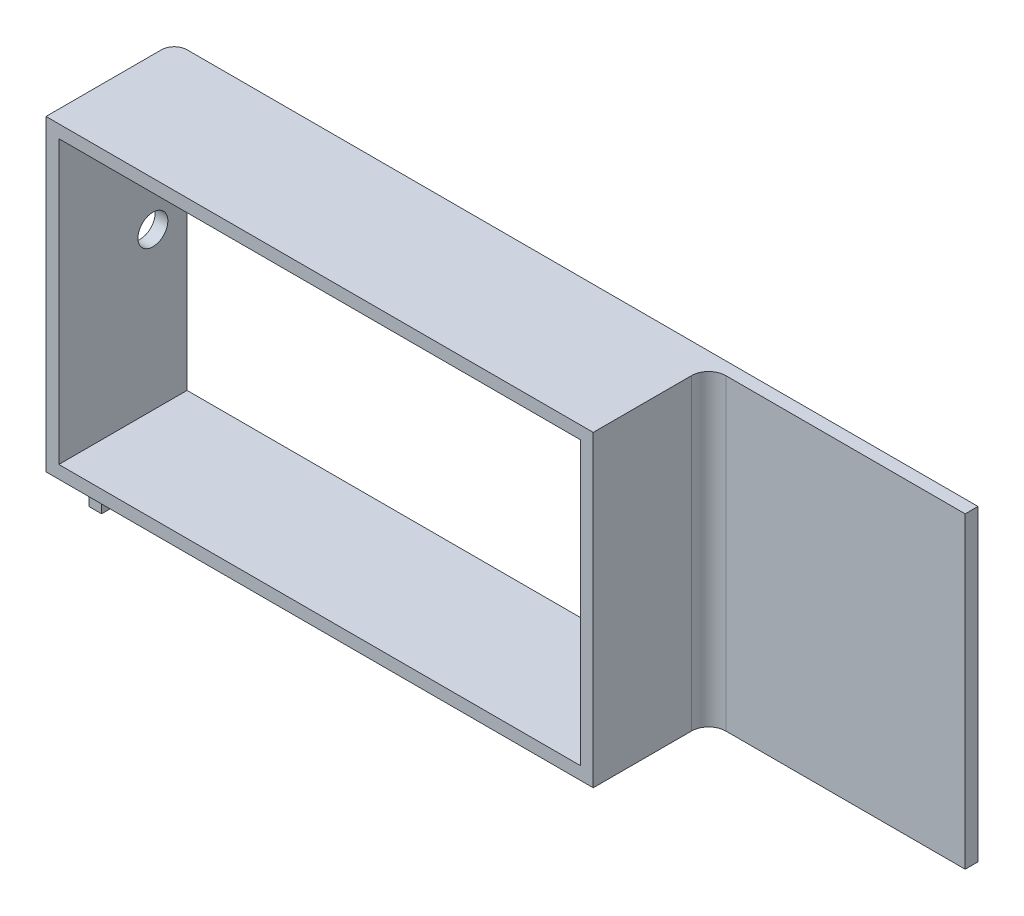
ISO-10303-21;
HEADER;
FILE_DESCRIPTION(('STEP AP214'),'2;1');
FILE_NAME('part.step','',(''),(''),'','','');
FILE_SCHEMA(('AUTOMOTIVE_DESIGN { 1 0 10303 214 1 1 1 1 }'));
ENDSEC;
DATA;
#1=APPLICATION_CONTEXT('core data for automotive mechanical design processes');
#2=APPLICATION_PROTOCOL_DEFINITION('international standard','automotive_design',2000,#1);
#3=PRODUCT_CONTEXT('',#1,'mechanical');
#4=PRODUCT('Part','Part','',(#3));
#5=PRODUCT_RELATED_PRODUCT_CATEGORY('part','',(#4));
#6=PRODUCT_DEFINITION_FORMATION('','',#4);
#7=PRODUCT_DEFINITION_CONTEXT('part definition',#1,'design');
#8=PRODUCT_DEFINITION('design','',#6,#7);
#9=PRODUCT_DEFINITION_SHAPE('','',#8);
#10=(LENGTH_UNIT() NAMED_UNIT(*) SI_UNIT(.MILLI.,.METRE.));
#11=(NAMED_UNIT(*) PLANE_ANGLE_UNIT() SI_UNIT($,.RADIAN.));
#12=(NAMED_UNIT(*) SI_UNIT($,.STERADIAN.) SOLID_ANGLE_UNIT());
#13=UNCERTAINTY_MEASURE_WITH_UNIT(LENGTH_MEASURE(1.E-05),#10,'distance_accuracy_value','');
#14=(GEOMETRIC_REPRESENTATION_CONTEXT(3) GLOBAL_UNCERTAINTY_ASSIGNED_CONTEXT((#13)) GLOBAL_UNIT_ASSIGNED_CONTEXT((#10,
#11,#12)) REPRESENTATION_CONTEXT('',''));
#15=CARTESIAN_POINT('',(0.,0.,0.));
#16=DIRECTION('',(0.,0.,1.));
#17=DIRECTION('',(1.,0.,0.));
#18=AXIS2_PLACEMENT_3D('',#15,#16,#17);
#19=CARTESIAN_POINT('',(0.,0.,0.));
#20=DIRECTION('',(0.,0.,-1.));
#21=DIRECTION('',(-1.,0.,0.));
#22=AXIS2_PLACEMENT_3D('',#19,#20,#21);
#23=PLANE('',#22);
#24=DIRECTION('',(1.,0.,0.));
#25=VECTOR('',#24,1.);
#26=CARTESIAN_POINT('',(30.5,-18.,0.));
#27=LINE('',#26,#25);
#28=CARTESIAN_POINT('',(-30.5,-18.,0.));
#29=VERTEX_POINT('',#28);
#30=CARTESIAN_POINT('',(62.,-18.,0.));
#31=VERTEX_POINT('',#30);
#32=EDGE_CURVE('E216',#29,#31,#27,.T.);
#33=ORIENTED_EDGE('',*,*,#32,.F.);
#34=DIRECTION('',(0.,-1.,0.));
#35=VECTOR('',#34,1.);
#36=CARTESIAN_POINT('',(-30.5,0.,0.));
#37=LINE('',#36,#35);
#38=CARTESIAN_POINT('',(-30.5,-16.5,0.));
#39=VERTEX_POINT('',#38);
#40=EDGE_CURVE('E98',#29,#39,#37,.F.);
#41=ORIENTED_EDGE('',*,*,#40,.T.);
#42=DIRECTION('',(1.,0.,0.));
#43=VECTOR('',#42,1.);
#44=CARTESIAN_POINT('',(-30.5,-16.5,0.));
#45=LINE('',#44,#43);
#46=CARTESIAN_POINT('',(30.5,-16.5,0.));
#47=VERTEX_POINT('',#46);
#48=EDGE_CURVE('E268',#39,#47,#45,.T.);
#49=ORIENTED_EDGE('',*,*,#48,.T.);
#50=DIRECTION('',(0.,1.,0.));
#51=VECTOR('',#50,1.);
#52=CARTESIAN_POINT('',(30.5,-16.5,0.));
#53=LINE('',#52,#51);
#54=CARTESIAN_POINT('',(30.5,16.5,0.));
#55=VERTEX_POINT('',#54);
#56=EDGE_CURVE('E291',#47,#55,#53,.T.);
#57=ORIENTED_EDGE('',*,*,#56,.T.);
#58=DIRECTION('',(-1.,0.,0.));
#59=VECTOR('',#58,1.);
#60=CARTESIAN_POINT('',(-30.5,16.5,0.));
#61=LINE('',#60,#59);
#62=CARTESIAN_POINT('',(-30.5,16.5,0.));
#63=VERTEX_POINT('',#62);
#64=EDGE_CURVE('E295',#55,#63,#61,.T.);
#65=ORIENTED_EDGE('',*,*,#64,.T.);
#66=DIRECTION('',(0.,-1.,0.));
#67=VECTOR('',#66,1.);
#68=CARTESIAN_POINT('',(-30.5,0.,0.));
#69=LINE('',#68,#67);
#70=CARTESIAN_POINT('',(-30.5,18.,0.));
#71=VERTEX_POINT('',#70);
#72=EDGE_CURVE('E105',#63,#71,#69,.F.);
#73=ORIENTED_EDGE('',*,*,#72,.T.);
#74=DIRECTION('',(-1.,0.,0.));
#75=VECTOR('',#74,1.);
#76=CARTESIAN_POINT('',(-30.5,18.,0.));
#77=LINE('',#76,#75);
#78=CARTESIAN_POINT('',(62.,18.,0.));
#79=VERTEX_POINT('',#78);
#80=EDGE_CURVE('E393',#79,#71,#77,.T.);
#81=ORIENTED_EDGE('',*,*,#80,.F.);
#82=DIRECTION('',(0.,1.,0.));
#83=VECTOR('',#82,1.);
#84=CARTESIAN_POINT('',(62.,18.,0.));
#85=LINE('',#84,#83);
#86=EDGE_CURVE('E224',#31,#79,#85,.T.);
#87=ORIENTED_EDGE('',*,*,#86,.F.);
#88=EDGE_LOOP('',(#33,#41,#49,#57,#65,#73,#81,#87));
#89=FACE_BOUND('',#88,.T.);
#90=ADVANCED_FACE('F89',(#89),#23,.T.);
#91=CARTESIAN_POINT('',(-30.5,18.,5.));
#92=DIRECTION('',(0.,1.,0.));
#93=DIRECTION('',(1.,0.,0.));
#94=AXIS2_PLACEMENT_3D('',#91,#92,#93);
#95=PLANE('',#94);
#96=ORIENTED_EDGE('',*,*,#80,.T.);
#97=CARTESIAN_POINT('',(-30.5,18.,1.5));
#98=DIRECTION('',(0.,1.,0.));
#99=DIRECTION('',(0.,0.,1.));
#100=AXIS2_PLACEMENT_3D('',#97,#98,#99);
#101=CIRCLE('',#100,1.5);
#102=CARTESIAN_POINT('',(-32.,18.,1.5));
#103=VERTEX_POINT('',#102);
#104=EDGE_CURVE('E12',#71,#103,#101,.T.);
#105=ORIENTED_EDGE('',*,*,#104,.T.);
#106=DIRECTION('',(0.,0.,1.));
#107=VECTOR('',#106,1.);
#108=CARTESIAN_POINT('',(-32.,18.,5.));
#109=LINE('',#108,#107);
#110=CARTESIAN_POINT('',(-32.,18.,15.));
#111=VERTEX_POINT('',#110);
#112=EDGE_CURVE('E281',#103,#111,#109,.T.);
#113=ORIENTED_EDGE('',*,*,#112,.T.);
#114=DIRECTION('',(-1.,0.,0.));
#115=VECTOR('',#114,1.);
#116=CARTESIAN_POINT('',(0.,18.,15.));
#117=LINE('',#116,#115);
#118=CARTESIAN_POINT('',(32.,18.,15.));
#119=VERTEX_POINT('',#118);
#120=EDGE_CURVE('E435',#119,#111,#117,.T.);
#121=ORIENTED_EDGE('',*,*,#120,.F.);
#122=DIRECTION('',(0.,0.,-1.));
#123=VECTOR('',#122,1.);
#124=CARTESIAN_POINT('',(32.,18.,5.));
#125=LINE('',#124,#123);
#126=CARTESIAN_POINT('',(32.,18.,3.5));
#127=VERTEX_POINT('',#126);
#128=EDGE_CURVE('E390',#119,#127,#125,.T.);
#129=ORIENTED_EDGE('',*,*,#128,.T.);
#130=CARTESIAN_POINT('',(34.,18.,3.5));
#131=DIRECTION('',(0.,1.,0.));
#132=DIRECTION('',(0.,0.,1.));
#133=AXIS2_PLACEMENT_3D('',#130,#131,#132);
#134=CIRCLE('',#133,2.);
#135=CARTESIAN_POINT('',(34.,18.,1.5));
#136=VERTEX_POINT('',#135);
#137=EDGE_CURVE('E249',#127,#136,#134,.F.);
#138=ORIENTED_EDGE('',*,*,#137,.T.);
#139=DIRECTION('',(-1.,0.,0.));
#140=VECTOR('',#139,1.);
#141=CARTESIAN_POINT('',(62.,18.,1.5));
#142=LINE('',#141,#140);
#143=CARTESIAN_POINT('',(62.,18.,1.5));
#144=VERTEX_POINT('',#143);
#145=EDGE_CURVE('E483',#144,#136,#142,.T.);
#146=ORIENTED_EDGE('',*,*,#145,.F.);
#147=DIRECTION('',(0.,0.,1.));
#148=VECTOR('',#147,1.);
#149=CARTESIAN_POINT('',(62.,18.,0.));
#150=LINE('',#149,#148);
#151=EDGE_CURVE('E395',#79,#144,#150,.T.);
#152=ORIENTED_EDGE('',*,*,#151,.F.);
#153=EDGE_LOOP('',(#96,#105,#113,#121,#129,#138,#146,#152));
#154=FACE_BOUND('',#153,.T.);
#155=ADVANCED_FACE('F361',(#154),#95,.T.);
#156=CARTESIAN_POINT('',(32.,16.5,5.));
#157=DIRECTION('',(1.,0.,0.));
#158=DIRECTION('',(0.,-1.,0.));
#159=AXIS2_PLACEMENT_3D('',#156,#157,#158);
#160=PLANE('',#159);
#161=DIRECTION('',(0.,0.,-1.));
#162=VECTOR('',#161,1.);
#163=CARTESIAN_POINT('',(32.,-18.,5.00000000000007));
#164=LINE('',#163,#162);
#165=CARTESIAN_POINT('',(32.,-18.,15.));
#166=VERTEX_POINT('',#165);
#167=CARTESIAN_POINT('',(32.,-18.,3.49999999999999));
#168=VERTEX_POINT('',#167);
#169=EDGE_CURVE('E403',#166,#168,#164,.T.);
#170=ORIENTED_EDGE('',*,*,#169,.T.);
#171=DIRECTION('',(0.,-1.,0.));
#172=VECTOR('',#171,1.);
#173=CARTESIAN_POINT('',(32.,16.5,3.5));
#174=LINE('',#173,#172);
#175=EDGE_CURVE('E243',#168,#127,#174,.F.);
#176=ORIENTED_EDGE('',*,*,#175,.T.);
#177=ORIENTED_EDGE('',*,*,#128,.F.);
#178=DIRECTION('',(0.,1.,0.));
#179=VECTOR('',#178,1.);
#180=CARTESIAN_POINT('',(32.,0.,15.));
#181=LINE('',#180,#179);
#182=EDGE_CURVE('E438',#166,#119,#181,.T.);
#183=ORIENTED_EDGE('',*,*,#182,.F.);
#184=EDGE_LOOP('',(#170,#176,#177,#183));
#185=FACE_BOUND('',#184,.T.);
#186=ADVANCED_FACE('F364',(#185),#160,.T.);
#187=CARTESIAN_POINT('',(-32.,-16.5,5.));
#188=DIRECTION('',(-1.,0.,0.));
#189=DIRECTION('',(0.,1.,0.));
#190=AXIS2_PLACEMENT_3D('',#187,#188,#189);
#191=PLANE('',#190);
#192=CARTESIAN_POINT('',(-32.,1.8,4.));
#193=DIRECTION('',(-1.,0.,0.));
#194=DIRECTION('',(0.,0.,1.));
#195=AXIS2_PLACEMENT_3D('',#192,#193,#194);
#196=CIRCLE('',#195,1.75);
#197=CARTESIAN_POINT('',(-32.,1.8,5.75));
#198=VERTEX_POINT('',#197);
#199=EDGE_CURVE('E377',#198,#198,#196,.T.);
#200=ORIENTED_EDGE('',*,*,#199,.F.);
#201=EDGE_LOOP('',(#200));
#202=FACE_BOUND('',#201,.T.);
#203=CARTESIAN_POINT('',(-32.,-18.5,4.));
#204=DIRECTION('',(-1.,0.,0.));
#205=DIRECTION('',(0.,0.,1.));
#206=AXIS2_PLACEMENT_3D('',#203,#204,#205);
#207=CIRCLE('',#206,1.75);
#208=CARTESIAN_POINT('',(-32.,-18.5,5.74999999999999));
#209=VERTEX_POINT('',#208);
#210=EDGE_CURVE('E225',#209,#209,#207,.T.);
#211=ORIENTED_EDGE('',*,*,#210,.F.);
#212=EDGE_LOOP('',(#211));
#213=FACE_BOUND('',#212,.T.);
#214=ORIENTED_EDGE('',*,*,#112,.F.);
#215=DIRECTION('',(0.,-1.,0.));
#216=VECTOR('',#215,1.);
#217=CARTESIAN_POINT('',(-32.,-16.5,1.5));
#218=LINE('',#217,#216);
#219=CARTESIAN_POINT('',(-32.,-24.,1.5));
#220=VERTEX_POINT('',#219);
#221=EDGE_CURVE('E252',#103,#220,#218,.T.);
#222=ORIENTED_EDGE('',*,*,#221,.T.);
#223=DIRECTION('',(0.,0.,-1.));
#224=VECTOR('',#223,1.);
#225=CARTESIAN_POINT('',(-32.,-24.,10.));
#226=LINE('',#225,#224);
#227=CARTESIAN_POINT('',(-32.,-24.,10.));
#228=VERTEX_POINT('',#227);
#229=EDGE_CURVE('E471',#228,#220,#226,.T.);
#230=ORIENTED_EDGE('',*,*,#229,.F.);
#231=DIRECTION('',(0.,1.,0.));
#232=VECTOR('',#231,1.);
#233=CARTESIAN_POINT('',(-32.,-24.,10.));
#234=LINE('',#233,#232);
#235=CARTESIAN_POINT('',(-32.,-18.,10.));
#236=VERTEX_POINT('',#235);
#237=EDGE_CURVE('E462',#228,#236,#234,.T.);
#238=ORIENTED_EDGE('',*,*,#237,.T.);
#239=DIRECTION('',(0.,0.,-1.));
#240=VECTOR('',#239,1.);
#241=CARTESIAN_POINT('',(-32.,-18.,5.));
#242=LINE('',#241,#240);
#243=CARTESIAN_POINT('',(-32.,-18.,15.));
#244=VERTEX_POINT('',#243);
#245=EDGE_CURVE('E398',#244,#236,#242,.T.);
#246=ORIENTED_EDGE('',*,*,#245,.F.);
#247=DIRECTION('',(0.,-1.,0.));
#248=VECTOR('',#247,1.);
#249=CARTESIAN_POINT('',(-32.,0.,15.));
#250=LINE('',#249,#248);
#251=EDGE_CURVE('E386',#111,#244,#250,.T.);
#252=ORIENTED_EDGE('',*,*,#251,.F.);
#253=EDGE_LOOP('',(#214,#222,#230,#238,#246,#252));
#254=FACE_BOUND('',#253,.T.);
#255=ADVANCED_FACE('F367',(#202,#213,#254),#191,.T.);
#256=CARTESIAN_POINT('',(30.5,-18.,5.));
#257=DIRECTION('',(0.,-1.,0.));
#258=DIRECTION('',(-1.,0.,0.));
#259=AXIS2_PLACEMENT_3D('',#256,#257,#258);
#260=PLANE('',#259);
#261=DIRECTION('',(-1.,0.,0.));
#262=VECTOR('',#261,1.);
#263=CARTESIAN_POINT('',(-32.,-18.,5.67705098312484));
#264=LINE('',#263,#262);
#265=CARTESIAN_POINT('',(-25.,-18.,5.67705098312484));
#266=VERTEX_POINT('',#265);
#267=CARTESIAN_POINT('',(-30.5,-18.,5.67705098312484));
#268=VERTEX_POINT('',#267);
#269=EDGE_CURVE('E221',#266,#268,#264,.T.);
#270=ORIENTED_EDGE('',*,*,#269,.F.);
#271=CARTESIAN_POINT('',(-29.3232503782709,-18.,-4.9311118333261));
#272=CARTESIAN_POINT('',(-29.1365861846258,-18.,-4.61995981008621));
#273=CARTESIAN_POINT('',(-28.9499409486491,-18.,-4.30879640538241));
#274=CARTESIAN_POINT('',(-28.576712037168,-18.,-3.68642888668085));
#275=CARTESIAN_POINT('',(-28.3901283622304,-18.,-3.37522477234314));
#276=CARTESIAN_POINT('',(-28.0170042022413,-18.,-2.75268777990166));
#277=CARTESIAN_POINT('',(-27.8304637387273,-18.,-2.44135488888876));
#278=CARTESIAN_POINT('',(-27.4575192083578,-18.,-1.81861109401738));
#279=CARTESIAN_POINT('',(-27.2711151403247,-18.,-1.50720019086432));
#280=CARTESIAN_POINT('',(-26.8988690355945,-18.,-0.884815924583893));
#281=CARTESIAN_POINT('',(-26.7130265945634,-18.,-0.573842803261734));
#282=CARTESIAN_POINT('',(-26.3417189703445,-18.,0.0483396558849613));
#283=CARTESIAN_POINT('',(-26.1562537969109,-18.,0.359548999538385));
#284=CARTESIAN_POINT('',(-25.8786807268299,-18.,0.826699278161345));
#285=CARTESIAN_POINT('',(-25.786268130386,-18.,0.98245913800232));
#286=CARTESIAN_POINT('',(-25.6017642083001,-18.,1.29417149691489));
#287=CARTESIAN_POINT('',(-25.5096728859582,-18.,1.45012399794316));
#288=CARTESIAN_POINT('',(-25.3260386471201,-18.,1.76234139121168));
#289=CARTESIAN_POINT('',(-25.2344957049191,-18.,1.91860626834427));
#290=CARTESIAN_POINT('',(-25.0523859004075,-18.,2.23170312007337));
#291=CARTESIAN_POINT('',(-24.961819015958,-18.,2.3885350816991));
#292=CARTESIAN_POINT('',(-24.8367834364572,-18.,2.60861686623486));
#293=CARTESIAN_POINT('',(-24.8013824100539,-18.,2.67133606564711));
#294=CARTESIAN_POINT('',(-24.7311087673501,-18.,2.79707781294478));
#295=CARTESIAN_POINT('',(-24.6962361959365,-18.,2.86010038600625));
#296=CARTESIAN_POINT('',(-24.6272454256758,-18.,2.98669816721583));
#297=CARTESIAN_POINT('',(-24.5931286232613,-18.,3.05027413781401));
#298=CARTESIAN_POINT('',(-24.5262226586485,-18.,3.17811703049957));
#299=CARTESIAN_POINT('',(-24.4934332730503,-18.,3.24238383399859));
#300=CARTESIAN_POINT('',(-24.4444670202297,-18.,3.34290427923979));
#301=CARTESIAN_POINT('',(-24.4274548916881,-18.,3.37874861040316));
#302=CARTESIAN_POINT('',(-24.3944845045105,-18.,3.4509162481231));
#303=CARTESIAN_POINT('',(-24.3785261084703,-18.,3.48723949148663));
#304=CARTESIAN_POINT('',(-24.3481622199933,-18.,3.56052292332454));
#305=CARTESIAN_POINT('',(-24.3337559709105,-18.,3.59748279116932));
#306=CARTESIAN_POINT('',(-24.3072683962555,-18.,3.67220968054098));
#307=CARTESIAN_POINT('',(-24.2951860136113,-18.,3.709976326356));
#308=CARTESIAN_POINT('',(-24.270763776629,-18.,3.80046975859016));
#309=CARTESIAN_POINT('',(-24.2599232044644,-18.,3.85364963569685));
#310=CARTESIAN_POINT('',(-24.2511114537532,-18.,3.93406049796122));
#311=CARTESIAN_POINT('',(-24.2494094075633,-18.,3.96088422348309));
#312=CARTESIAN_POINT('',(-24.2486199884126,-18.,4.01457250934908));
#313=CARTESIAN_POINT('',(-24.249532603537,-18.,4.04143706950656));
#314=CARTESIAN_POINT('',(-24.2544180372332,-18.,4.10159309238413));
#315=CARTESIAN_POINT('',(-24.2590934097558,-18.,4.13482680223716));
#316=CARTESIAN_POINT('',(-24.2716720047549,-18.,4.20068362019447));
#317=CARTESIAN_POINT('',(-24.2795786403578,-18.,4.23330604438427));
#318=CARTESIAN_POINT('',(-24.2978899253859,-18.,4.29827587697522));
#319=CARTESIAN_POINT('',(-24.308325367104,-18.,4.3306143655138));
#320=CARTESIAN_POINT('',(-24.3309200680841,-18.,4.39466187687237));
#321=CARTESIAN_POINT('',(-24.3430788853059,-18.,4.42637105873713));
#322=CARTESIAN_POINT('',(-24.369668410396,-18.,4.49190015862718));
#323=CARTESIAN_POINT('',(-24.3842039024285,-18.,4.52567707902334));
#324=CARTESIAN_POINT('',(-24.4142680660518,-18.,4.59278827647244));
#325=CARTESIAN_POINT('',(-24.4297969035328,-18.,4.62612247846227));
#326=CARTESIAN_POINT('',(-24.47743978503,-18.,4.72565970957069));
#327=CARTESIAN_POINT('',(-24.510594978285,-18.,4.79136182210341));
#328=CARTESIAN_POINT('',(-24.5784542315181,-18.,4.92210003632709));
#329=CARTESIAN_POINT('',(-24.6131610135111,-18.,4.98713470006324));
#330=CARTESIAN_POINT('',(-24.6834682321635,-18.,5.11669007124933));
#331=CARTESIAN_POINT('',(-24.7190683638855,-18.,5.18121094443159));
#332=CARTESIAN_POINT('',(-24.7907122558975,-18.,5.30969181034658));
#333=CARTESIAN_POINT('',(-24.8267538878944,-18.,5.37365299498736));
#334=CARTESIAN_POINT('',(-24.8992300000327,-18.,5.50135938333925));
#335=CARTESIAN_POINT('',(-24.9356645135189,-18.,5.56510456810484));
#336=CARTESIAN_POINT('',(-25.0452871948055,-18.,5.75595828537702));
#337=CARTESIAN_POINT('',(-25.1188788655028,-18.,5.88283478067142));
#338=CARTESIAN_POINT('',(-25.266759517308,-18.,6.13644256855225));
#339=CARTESIAN_POINT('',(-25.3410494006125,-18.,6.2631733333513));
#340=CARTESIAN_POINT('',(-25.4899923203025,-18.,6.51642139925996));
#341=CARTESIAN_POINT('',(-25.5646453570926,-18.,6.64293870013151));
#342=CARTESIAN_POINT('',(-25.7889516955615,-18.,7.02229101855747));
#343=CARTESIAN_POINT('',(-25.9389496630838,-18.,7.2749220824006));
#344=CARTESIAN_POINT('',(-26.2394692742675,-18.,7.7800563626787));
#345=CARTESIAN_POINT('',(-26.3899911564309,-18.,8.03255943701014));
#346=CARTESIAN_POINT('',(-26.6912915222312,-18.,8.53741009596424));
#347=CARTESIAN_POINT('',(-26.8420700041057,-18.,8.78975768163872));
#348=CARTESIAN_POINT('',(-27.1434811793823,-18.,9.29384926959693));
#349=CARTESIAN_POINT('',(-27.2941135535738,-18.,9.5455934628149));
#350=CARTESIAN_POINT('',(-27.5954837843437,-18.,10.0490194857774));
#351=CARTESIAN_POINT('',(-27.7462216411638,-18.,10.3007013153774));
#352=CARTESIAN_POINT('',(-28.0476843784359,-18.,10.8038783787076));
#353=CARTESIAN_POINT('',(-28.198409217574,-18.,11.0553736371927));
#354=CARTESIAN_POINT('',(-28.4999124706825,-18.,11.5583312150789));
#355=CARTESIAN_POINT('',(-28.650690884523,-18.,11.8097935345581));
#356=CARTESIAN_POINT('',(-28.8014869209592,-18.,12.0612452808757));
#357=B_SPLINE_CURVE_WITH_KNOTS('',3,(#271,#272,#273,#274,#275,#276,#277,#278,#279,#280,#281,
#282,#283,#284,#285,#286,#287,#288,#289,#290,#291,#292,#293,#294,#295,#296,#297,#298,#299,#300,
#301,#302,#303,#304,#305,#306,#307,#308,#309,#310,#311,#312,#313,#314,#315,#316,#317,#318,#319,
#320,#321,#322,#323,#324,#325,#326,#327,#328,#329,#330,#331,#332,#333,#334,#335,#336,#337,#338,
#339,#340,#341,#342,#343,#344,#345,#346,#347,#348,#349,#350,#351,#352,#353,#354,#355,#356),
.UNSPECIFIED.,.F.,.F.,(4,2,2,2,2,2,2,2,2,2,2,2,2,2,2,2,2,2,2,2,2,2,2,2,2,2,2,2,2,2,2,2,2,2,2,2,
2,2,2,2,2,2,4),(0.,1.08854579555149,2.17710135016847,3.26592162529464,4.35473238664672,
5.44155121445499,6.52839779351688,7.0717308865173,7.61506954433557,8.15838253105363,
8.70168316834796,8.91774269916141,9.13382048031433,9.35026886341884,9.56668066621197,
9.68569841074537,9.80470060486331,9.92364452236136,10.0425342064555,10.2045900735913,
10.2851049971675,10.3656195538479,10.4660940933649,10.5666750378149,10.668548376345,
10.7703956318296,10.8806879392035,10.9909987139046,11.2117361398362,11.4328773022108,
11.6539439800045,11.8741928669394,12.0944605963879,12.5344803126085,12.9751803438841,
13.4158808663126,14.2972971071286,15.179187988736,16.0610728376209,16.9411792003213,
17.8212875853472,18.7008957750009,19.5805018444526),.UNSPECIFIED.);
#358=CARTESIAN_POINT('',(-25.,-18.,2.32294901687515));
#359=VERTEX_POINT('',#358);
#360=EDGE_CURVE('E206',#359,#266,#357,.T.);
#361=ORIENTED_EDGE('',*,*,#360,.F.);
#362=DIRECTION('',(-1.,0.,0.));
#363=VECTOR('',#362,1.);
#364=CARTESIAN_POINT('',(-32.,-18.,2.32294901687515));
#365=LINE('',#364,#363);
#366=CARTESIAN_POINT('',(-30.5,-18.,2.32294901687515));
#367=VERTEX_POINT('',#366);
#368=EDGE_CURVE('E215',#367,#359,#365,.F.);
#369=ORIENTED_EDGE('',*,*,#368,.F.);
#370=DIRECTION('',(0.,0.,1.));
#371=VECTOR('',#370,1.);
#372=CARTESIAN_POINT('',(-30.5,-18.,10.));
#373=LINE('',#372,#371);
#374=EDGE_CURVE('E472',#29,#367,#373,.T.);
#375=ORIENTED_EDGE('',*,*,#374,.F.);
#376=ORIENTED_EDGE('',*,*,#32,.T.);
#377=DIRECTION('',(0.,0.,-1.));
#378=VECTOR('',#377,1.);
#379=CARTESIAN_POINT('',(62.,-18.,0.));
#380=LINE('',#379,#378);
#381=CARTESIAN_POINT('',(62.,-18.,1.49999999999999));
#382=VERTEX_POINT('',#381);
#383=EDGE_CURVE('E491',#382,#31,#380,.T.);
#384=ORIENTED_EDGE('',*,*,#383,.F.);
#385=DIRECTION('',(-1.,0.,0.));
#386=VECTOR('',#385,1.);
#387=CARTESIAN_POINT('',(62.,-18.,1.49999999999999));
#388=LINE('',#387,#386);
#389=CARTESIAN_POINT('',(34.,-18.,1.49999999999999));
#390=VERTEX_POINT('',#389);
#391=EDGE_CURVE('E487',#382,#390,#388,.T.);
#392=ORIENTED_EDGE('',*,*,#391,.T.);
#393=CARTESIAN_POINT('',(34.,-18.,3.49999999999999));
#394=DIRECTION('',(0.,-1.,0.));
#395=DIRECTION('',(0.,0.,-1.));
#396=AXIS2_PLACEMENT_3D('',#393,#394,#395);
#397=CIRCLE('',#396,2.);
#398=EDGE_CURVE('E246',#390,#168,#397,.F.);
#399=ORIENTED_EDGE('',*,*,#398,.T.);
#400=ORIENTED_EDGE('',*,*,#169,.F.);
#401=DIRECTION('',(1.,0.,0.));
#402=VECTOR('',#401,1.);
#403=CARTESIAN_POINT('',(0.,-18.,15.));
#404=LINE('',#403,#402);
#405=EDGE_CURVE('E429',#244,#166,#404,.T.);
#406=ORIENTED_EDGE('',*,*,#405,.F.);
#407=ORIENTED_EDGE('',*,*,#245,.T.);
#408=DIRECTION('',(-1.,0.,0.));
#409=VECTOR('',#408,1.);
#410=CARTESIAN_POINT('',(-32.,-18.,10.));
#411=LINE('',#410,#409);
#412=CARTESIAN_POINT('',(-30.5,-18.,10.));
#413=VERTEX_POINT('',#412);
#414=EDGE_CURVE('E467',#413,#236,#411,.T.);
#415=ORIENTED_EDGE('',*,*,#414,.F.);
#416=EDGE_CURVE('E230',#268,#413,#373,.T.);
#417=ORIENTED_EDGE('',*,*,#416,.F.);
#418=EDGE_LOOP('',(#270,#361,#369,#375,#376,#384,#392,#399,#400,#406,#407,#415,#417));
#419=FACE_BOUND('',#418,.T.);
#420=ADVANCED_FACE('F228',(#419),#260,.T.);
#421=CARTESIAN_POINT('',(-30.5,16.5,5.));
#422=DIRECTION('',(0.,1.,0.));
#423=DIRECTION('',(1.,0.,0.));
#424=AXIS2_PLACEMENT_3D('',#421,#422,#423);
#425=PLANE('',#424);
#426=DIRECTION('',(0.,0.,-1.));
#427=VECTOR('',#426,1.);
#428=CARTESIAN_POINT('',(30.5,16.5,2.8375));
#429=LINE('',#428,#427);
#430=CARTESIAN_POINT('',(30.5,16.5,15.));
#431=VERTEX_POINT('',#430);
#432=EDGE_CURVE('E418',#431,#55,#429,.T.);
#433=ORIENTED_EDGE('',*,*,#432,.F.);
#434=DIRECTION('',(-1.,0.,0.));
#435=VECTOR('',#434,1.);
#436=CARTESIAN_POINT('',(30.5,16.5,15.));
#437=LINE('',#436,#435);
#438=CARTESIAN_POINT('',(-30.5,16.5,15.));
#439=VERTEX_POINT('',#438);
#440=EDGE_CURVE('E447',#431,#439,#437,.T.);
#441=ORIENTED_EDGE('',*,*,#440,.T.);
#442=DIRECTION('',(0.,0.,1.));
#443=VECTOR('',#442,1.);
#444=CARTESIAN_POINT('',(-30.5,16.5,2.8375));
#445=LINE('',#444,#443);
#446=EDGE_CURVE('E424',#63,#439,#445,.T.);
#447=ORIENTED_EDGE('',*,*,#446,.F.);
#448=ORIENTED_EDGE('',*,*,#64,.F.);
#449=EDGE_LOOP('',(#433,#441,#447,#448));
#450=FACE_BOUND('',#449,.T.);
#451=ADVANCED_FACE('F346',(#450),#425,.F.);
#452=CARTESIAN_POINT('',(30.5,16.5,5.));
#453=DIRECTION('',(1.,0.,0.));
#454=DIRECTION('',(0.,-1.,0.));
#455=AXIS2_PLACEMENT_3D('',#452,#453,#454);
#456=PLANE('',#455);
#457=DIRECTION('',(0.,0.,-1.));
#458=VECTOR('',#457,1.);
#459=CARTESIAN_POINT('',(30.5,-16.5,2.8375));
#460=LINE('',#459,#458);
#461=CARTESIAN_POINT('',(30.5,-16.5,15.));
#462=VERTEX_POINT('',#461);
#463=EDGE_CURVE('E278',#462,#47,#460,.T.);
#464=ORIENTED_EDGE('',*,*,#463,.F.);
#465=DIRECTION('',(0.,1.,0.));
#466=VECTOR('',#465,1.);
#467=CARTESIAN_POINT('',(30.5,16.5,15.));
#468=LINE('',#467,#466);
#469=EDGE_CURVE('E451',#462,#431,#468,.T.);
#470=ORIENTED_EDGE('',*,*,#469,.T.);
#471=ORIENTED_EDGE('',*,*,#432,.T.);
#472=ORIENTED_EDGE('',*,*,#56,.F.);
#473=EDGE_LOOP('',(#464,#470,#471,#472));
#474=FACE_BOUND('',#473,.T.);
#475=ADVANCED_FACE('F349',(#474),#456,.F.);
#476=CARTESIAN_POINT('',(-30.5,-16.5,5.));
#477=DIRECTION('',(-1.,0.,0.));
#478=DIRECTION('',(0.,1.,0.));
#479=AXIS2_PLACEMENT_3D('',#476,#477,#478);
#480=PLANE('',#479);
#481=CARTESIAN_POINT('',(-30.5,1.8,4.));
#482=DIRECTION('',(-1.,0.,0.));
#483=DIRECTION('',(0.,0.,1.));
#484=AXIS2_PLACEMENT_3D('',#481,#482,#483);
#485=CIRCLE('',#484,1.75);
#486=CARTESIAN_POINT('',(-30.5,1.8,5.75));
#487=VERTEX_POINT('',#486);
#488=EDGE_CURVE('E504',#487,#487,#485,.T.);
#489=ORIENTED_EDGE('',*,*,#488,.T.);
#490=EDGE_LOOP('',(#489));
#491=FACE_BOUND('',#490,.T.);
#492=ORIENTED_EDGE('',*,*,#446,.T.);
#493=DIRECTION('',(0.,-1.,0.));
#494=VECTOR('',#493,1.);
#495=CARTESIAN_POINT('',(-30.5,16.5,15.));
#496=LINE('',#495,#494);
#497=CARTESIAN_POINT('',(-30.5,-16.5,15.));
#498=VERTEX_POINT('',#497);
#499=EDGE_CURVE('E288',#439,#498,#496,.T.);
#500=ORIENTED_EDGE('',*,*,#499,.T.);
#501=DIRECTION('',(0.,0.,-1.));
#502=VECTOR('',#501,1.);
#503=CARTESIAN_POINT('',(-30.5,-16.5,2.8375));
#504=LINE('',#503,#502);
#505=EDGE_CURVE('E276',#498,#39,#504,.T.);
#506=ORIENTED_EDGE('',*,*,#505,.T.);
#507=DIRECTION('',(0.,-1.,0.));
#508=VECTOR('',#507,1.);
#509=CARTESIAN_POINT('',(-30.5,-16.5,0.));
#510=LINE('',#509,#508);
#511=EDGE_CURVE('E282',#63,#39,#510,.T.);
#512=ORIENTED_EDGE('',*,*,#511,.F.);
#513=EDGE_LOOP('',(#492,#500,#506,#512));
#514=FACE_BOUND('',#513,.T.);
#515=ADVANCED_FACE('F286',(#491,#514),#480,.F.);
#516=CARTESIAN_POINT('',(30.5,-16.5,5.));
#517=DIRECTION('',(0.,-1.,0.));
#518=DIRECTION('',(-1.,0.,0.));
#519=AXIS2_PLACEMENT_3D('',#516,#517,#518);
#520=PLANE('',#519);
#521=ORIENTED_EDGE('',*,*,#505,.F.);
#522=DIRECTION('',(1.,0.,0.));
#523=VECTOR('',#522,1.);
#524=CARTESIAN_POINT('',(30.5,-16.5,15.));
#525=LINE('',#524,#523);
#526=EDGE_CURVE('E442',#498,#462,#525,.T.);
#527=ORIENTED_EDGE('',*,*,#526,.T.);
#528=ORIENTED_EDGE('',*,*,#463,.T.);
#529=ORIENTED_EDGE('',*,*,#48,.F.);
#530=EDGE_LOOP('',(#521,#527,#528,#529));
#531=FACE_BOUND('',#530,.T.);
#532=ADVANCED_FACE('F274',(#531),#520,.F.);
#533=CARTESIAN_POINT('',(0.,0.,15.));
#534=DIRECTION('',(0.,0.,1.));
#535=DIRECTION('',(1.,0.,0.));
#536=AXIS2_PLACEMENT_3D('',#533,#534,#535);
#537=PLANE('',#536);
#538=ORIENTED_EDGE('',*,*,#182,.T.);
#539=ORIENTED_EDGE('',*,*,#120,.T.);
#540=ORIENTED_EDGE('',*,*,#251,.T.);
#541=ORIENTED_EDGE('',*,*,#405,.T.);
#542=EDGE_LOOP('',(#538,#539,#540,#541));
#543=FACE_BOUND('',#542,.T.);
#544=ORIENTED_EDGE('',*,*,#440,.F.);
#545=ORIENTED_EDGE('',*,*,#469,.F.);
#546=ORIENTED_EDGE('',*,*,#526,.F.);
#547=ORIENTED_EDGE('',*,*,#499,.F.);
#548=EDGE_LOOP('',(#544,#545,#546,#547));
#549=FACE_BOUND('',#548,.T.);
#550=ADVANCED_FACE('F341',(#543,#549),#537,.T.);
#551=CARTESIAN_POINT('',(-30.5,-24.,10.));
#552=DIRECTION('',(-1.,0.,0.));
#553=DIRECTION('',(0.,-1.,0.));
#554=AXIS2_PLACEMENT_3D('',#551,#552,#553);
#555=PLANE('',#554);
#556=ORIENTED_EDGE('',*,*,#374,.T.);
#557=CARTESIAN_POINT('',(-30.5,-18.5,4.));
#558=DIRECTION('',(-1.,0.,0.));
#559=DIRECTION('',(0.,-1.,0.));
#560=AXIS2_PLACEMENT_3D('',#557,#558,#559);
#561=CIRCLE('',#560,1.75);
#562=EDGE_CURVE('E232',#367,#268,#561,.T.);
#563=ORIENTED_EDGE('',*,*,#562,.T.);
#564=ORIENTED_EDGE('',*,*,#416,.T.);
#565=DIRECTION('',(0.,1.,0.));
#566=VECTOR('',#565,1.);
#567=CARTESIAN_POINT('',(-30.5,-24.,10.));
#568=LINE('',#567,#566);
#569=CARTESIAN_POINT('',(-30.5,-24.,10.));
#570=VERTEX_POINT('',#569);
#571=EDGE_CURVE('E458',#570,#413,#568,.T.);
#572=ORIENTED_EDGE('',*,*,#571,.F.);
#573=DIRECTION('',(0.,0.,1.));
#574=VECTOR('',#573,1.);
#575=CARTESIAN_POINT('',(-30.5,-24.,10.));
#576=LINE('',#575,#574);
#577=CARTESIAN_POINT('',(-30.5,-24.,0.));
#578=VERTEX_POINT('',#577);
#579=EDGE_CURVE('E478',#578,#570,#576,.T.);
#580=ORIENTED_EDGE('',*,*,#579,.F.);
#581=DIRECTION('',(0.,1.,0.));
#582=VECTOR('',#581,1.);
#583=CARTESIAN_POINT('',(-30.5,-24.,0.));
#584=LINE('',#583,#582);
#585=EDGE_CURVE('E455',#578,#29,#584,.T.);
#586=ORIENTED_EDGE('',*,*,#585,.T.);
#587=EDGE_LOOP('',(#556,#563,#564,#572,#580,#586));
#588=FACE_BOUND('',#587,.T.);
#589=ADVANCED_FACE('F337',(#588),#555,.F.);
#590=CARTESIAN_POINT('',(-32.,-24.,10.));
#591=DIRECTION('',(0.,0.,-1.));
#592=DIRECTION('',(0.,1.,0.));
#593=AXIS2_PLACEMENT_3D('',#590,#591,#592);
#594=PLANE('',#593);
#595=ORIENTED_EDGE('',*,*,#414,.T.);
#596=ORIENTED_EDGE('',*,*,#237,.F.);
#597=DIRECTION('',(-1.,0.,0.));
#598=VECTOR('',#597,1.);
#599=CARTESIAN_POINT('',(-32.,-24.,10.));
#600=LINE('',#599,#598);
#601=EDGE_CURVE('E466',#570,#228,#600,.T.);
#602=ORIENTED_EDGE('',*,*,#601,.F.);
#603=ORIENTED_EDGE('',*,*,#571,.T.);
#604=EDGE_LOOP('',(#595,#596,#602,#603));
#605=FACE_BOUND('',#604,.T.);
#606=ADVANCED_FACE('F333',(#605),#594,.F.);
#607=CARTESIAN_POINT('',(0.,-24.,0.));
#608=DIRECTION('',(0.,-1.,0.));
#609=DIRECTION('',(0.,0.,-1.));
#610=AXIS2_PLACEMENT_3D('',#607,#608,#609);
#611=PLANE('',#610);
#612=ORIENTED_EDGE('',*,*,#229,.T.);
#613=CARTESIAN_POINT('',(-30.5,-24.,1.5));
#614=DIRECTION('',(0.,-1.,0.));
#615=DIRECTION('',(0.,0.,-1.));
#616=AXIS2_PLACEMENT_3D('',#613,#614,#615);
#617=CIRCLE('',#616,1.5);
#618=EDGE_CURVE('E113',#220,#578,#617,.T.);
#619=ORIENTED_EDGE('',*,*,#618,.T.);
#620=ORIENTED_EDGE('',*,*,#579,.T.);
#621=ORIENTED_EDGE('',*,*,#601,.T.);
#622=EDGE_LOOP('',(#612,#619,#620,#621));
#623=FACE_BOUND('',#622,.T.);
#624=ADVANCED_FACE('F329',(#623),#611,.T.);
#625=CARTESIAN_POINT('',(62.,18.,1.5));
#626=DIRECTION('',(0.,0.,-1.));
#627=DIRECTION('',(0.,1.,0.));
#628=AXIS2_PLACEMENT_3D('',#625,#626,#627);
#629=PLANE('',#628);
#630=ORIENTED_EDGE('',*,*,#145,.T.);
#631=DIRECTION('',(0.,-1.,0.));
#632=VECTOR('',#631,1.);
#633=CARTESIAN_POINT('',(34.,18.,1.5));
#634=LINE('',#633,#632);
#635=EDGE_CURVE('E236',#136,#390,#634,.T.);
#636=ORIENTED_EDGE('',*,*,#635,.T.);
#637=ORIENTED_EDGE('',*,*,#391,.F.);
#638=DIRECTION('',(0.,-1.,0.));
#639=VECTOR('',#638,1.);
#640=CARTESIAN_POINT('',(62.,18.,1.5));
#641=LINE('',#640,#639);
#642=EDGE_CURVE('E495',#144,#382,#641,.T.);
#643=ORIENTED_EDGE('',*,*,#642,.F.);
#644=EDGE_LOOP('',(#630,#636,#637,#643));
#645=FACE_BOUND('',#644,.T.);
#646=ADVANCED_FACE('F325',(#645),#629,.F.);
#647=CARTESIAN_POINT('',(62.,0.,0.));
#648=DIRECTION('',(-1.,0.,0.));
#649=DIRECTION('',(0.,0.,1.));
#650=AXIS2_PLACEMENT_3D('',#647,#648,#649);
#651=PLANE('',#650);
#652=ORIENTED_EDGE('',*,*,#86,.T.);
#653=ORIENTED_EDGE('',*,*,#151,.T.);
#654=ORIENTED_EDGE('',*,*,#642,.T.);
#655=ORIENTED_EDGE('',*,*,#383,.T.);
#656=EDGE_LOOP('',(#652,#653,#654,#655));
#657=FACE_BOUND('',#656,.T.);
#658=ADVANCED_FACE('F321',(#657),#651,.F.);
#659=CARTESIAN_POINT('',(-25.,-18.5,4.));
#660=DIRECTION('',(-1.,0.,0.));
#661=DIRECTION('',(0.,0.,1.));
#662=AXIS2_PLACEMENT_3D('',#659,#660,#661);
#663=CONICAL_SURFACE('',#662,1.75,1.02974425867665);
#664=ORIENTED_EDGE('',*,*,#360,.T.);
#665=CARTESIAN_POINT('',(-25.,-18.5,4.));
#666=DIRECTION('',(-1.,0.,0.));
#667=DIRECTION('',(0.,0.,1.));
#668=AXIS2_PLACEMENT_3D('',#665,#666,#667);
#669=CIRCLE('',#668,1.75);
#670=EDGE_CURVE('E209',#266,#359,#669,.T.);
#671=ORIENTED_EDGE('',*,*,#670,.T.);
#672=EDGE_LOOP('',(#664,#671));
#673=FACE_BOUND('',#672,.T.);
#674=ADVANCED_FACE('F208',(#673),#663,.F.);
#675=CARTESIAN_POINT('',(-32.,-18.5,4.));
#676=DIRECTION('',(-1.,0.,0.));
#677=DIRECTION('',(0.,0.,1.));
#678=AXIS2_PLACEMENT_3D('',#675,#676,#677);
#679=CYLINDRICAL_SURFACE('',#678,1.75);
#680=ORIENTED_EDGE('',*,*,#269,.T.);
#681=ORIENTED_EDGE('',*,*,#562,.F.);
#682=ORIENTED_EDGE('',*,*,#368,.T.);
#683=ORIENTED_EDGE('',*,*,#670,.F.);
#684=EDGE_LOOP('',(#680,#681,#682,#683));
#685=FACE_BOUND('',#684,.T.);
#686=ORIENTED_EDGE('',*,*,#210,.T.);
#687=EDGE_LOOP('',(#686));
#688=FACE_BOUND('',#687,.T.);
#689=ADVANCED_FACE('F219',(#685,#688),#679,.F.);
#690=CARTESIAN_POINT('',(-32.,1.8,4.));
#691=DIRECTION('',(-1.,0.,0.));
#692=DIRECTION('',(0.,0.,1.));
#693=AXIS2_PLACEMENT_3D('',#690,#691,#692);
#694=CYLINDRICAL_SURFACE('',#693,1.75);
#695=ORIENTED_EDGE('',*,*,#199,.T.);
#696=EDGE_LOOP('',(#695));
#697=FACE_BOUND('',#696,.T.);
#698=ORIENTED_EDGE('',*,*,#488,.F.);
#699=EDGE_LOOP('',(#698));
#700=FACE_BOUND('',#699,.T.);
#701=ADVANCED_FACE('F510',(#697,#700),#694,.F.);
#702=CARTESIAN_POINT('',(34.,18.,3.5));
#703=DIRECTION('',(0.,-1.,0.));
#704=DIRECTION('',(0.,0.,-1.));
#705=AXIS2_PLACEMENT_3D('',#702,#703,#704);
#706=CYLINDRICAL_SURFACE('',#705,2.);
#707=ORIENTED_EDGE('',*,*,#137,.F.);
#708=ORIENTED_EDGE('',*,*,#175,.F.);
#709=ORIENTED_EDGE('',*,*,#398,.F.);
#710=ORIENTED_EDGE('',*,*,#635,.F.);
#711=EDGE_LOOP('',(#707,#708,#709,#710));
#712=FACE_BOUND('',#711,.T.);
#713=ADVANCED_FACE('F513',(#712),#706,.F.);
#714=CARTESIAN_POINT('',(-30.5,-16.5,1.5));
#715=DIRECTION('',(0.,-1.,0.));
#716=DIRECTION('',(0.,0.,-1.));
#717=AXIS2_PLACEMENT_3D('',#714,#715,#716);
#718=CYLINDRICAL_SURFACE('',#717,1.5);
#719=ORIENTED_EDGE('',*,*,#40,.F.);
#720=ORIENTED_EDGE('',*,*,#585,.F.);
#721=ORIENTED_EDGE('',*,*,#618,.F.);
#722=ORIENTED_EDGE('',*,*,#221,.F.);
#723=ORIENTED_EDGE('',*,*,#104,.F.);
#724=ORIENTED_EDGE('',*,*,#72,.F.);
#725=ORIENTED_EDGE('',*,*,#511,.T.);
#726=EDGE_LOOP('',(#719,#720,#721,#722,#723,#724,#725));
#727=FACE_BOUND('',#726,.T.);
#728=ADVANCED_FACE('F91',(#727),#718,.T.);
#729=CLOSED_SHELL('',(#90,#155,#186,#255,#420,#451,#475,#515,#532,#550,#589,#606,#624,#646,#658,
#674,#689,#701,#713,#728));
#730=MANIFOLD_SOLID_BREP('B2',#729);
#731=ADVANCED_BREP_SHAPE_REPRESENTATION('',(#18,#730),#14);
#732=SHAPE_DEFINITION_REPRESENTATION(#9,#731);
ENDSEC;
END-ISO-10303-21;
